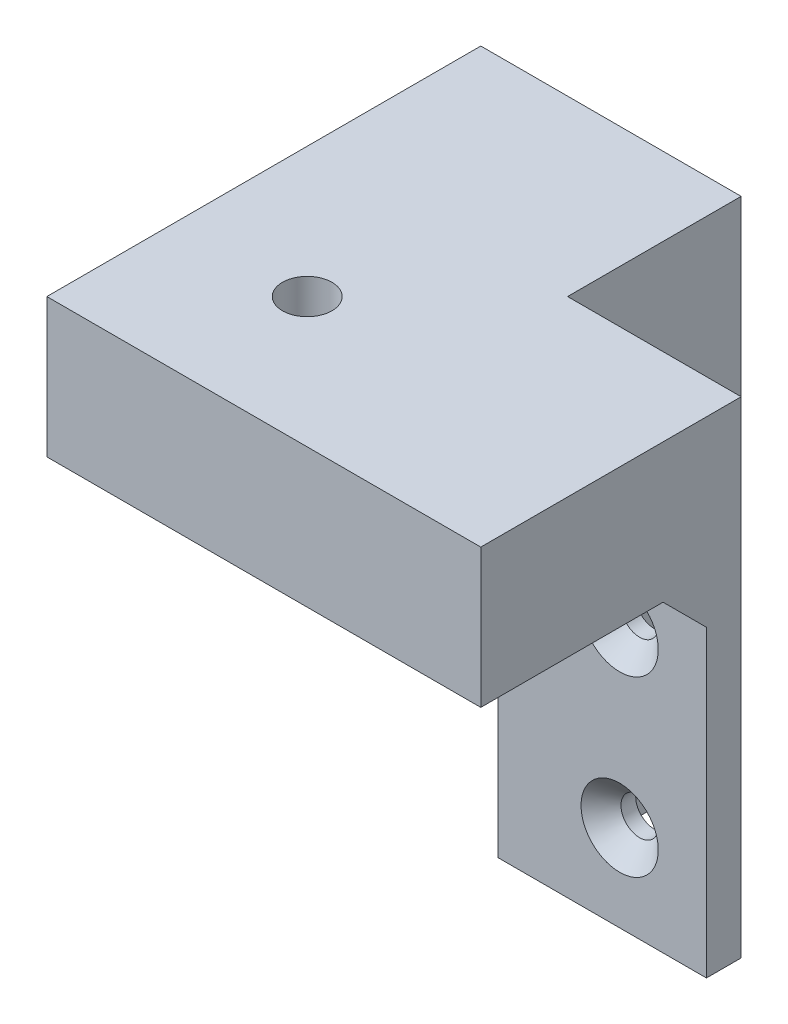
ISO-10303-21;
HEADER;
FILE_DESCRIPTION(('STEP AP214'),'2;1');
FILE_NAME('part.step','',(''),(''),'','','');
FILE_SCHEMA(('AUTOMOTIVE_DESIGN { 1 0 10303 214 1 1 1 1 }'));
ENDSEC;
DATA;
#1=APPLICATION_CONTEXT('core data for automotive mechanical design processes');
#2=APPLICATION_PROTOCOL_DEFINITION('international standard','automotive_design',2000,#1);
#3=PRODUCT_CONTEXT('',#1,'mechanical');
#4=PRODUCT('Part','Part','',(#3));
#5=PRODUCT_RELATED_PRODUCT_CATEGORY('part','',(#4));
#6=PRODUCT_DEFINITION_FORMATION('','',#4);
#7=PRODUCT_DEFINITION_CONTEXT('part definition',#1,'design');
#8=PRODUCT_DEFINITION('design','',#6,#7);
#9=PRODUCT_DEFINITION_SHAPE('','',#8);
#10=(LENGTH_UNIT() NAMED_UNIT(*) SI_UNIT(.MILLI.,.METRE.));
#11=(NAMED_UNIT(*) PLANE_ANGLE_UNIT() SI_UNIT($,.RADIAN.));
#12=(NAMED_UNIT(*) SI_UNIT($,.STERADIAN.) SOLID_ANGLE_UNIT());
#13=UNCERTAINTY_MEASURE_WITH_UNIT(LENGTH_MEASURE(1.E-05),#10,'distance_accuracy_value','');
#14=(GEOMETRIC_REPRESENTATION_CONTEXT(3) GLOBAL_UNCERTAINTY_ASSIGNED_CONTEXT((#13)) GLOBAL_UNIT_ASSIGNED_CONTEXT((#10,
#11,#12)) REPRESENTATION_CONTEXT('',''));
#15=CARTESIAN_POINT('',(0.,0.,0.));
#16=DIRECTION('',(0.,0.,1.));
#17=DIRECTION('',(1.,0.,0.));
#18=AXIS2_PLACEMENT_3D('',#15,#16,#17);
#19=CARTESIAN_POINT('',(-39.9999999999991,-16.,30.));
#20=DIRECTION('',(0.,1.,0.));
#21=DIRECTION('',(0.,0.,1.));
#22=AXIS2_PLACEMENT_3D('',#19,#20,#21);
#23=PLANE('',#22);
#24=CARTESIAN_POINT('',(-24.9999999999991,-16.,15.));
#25=DIRECTION('',(0.,1.,0.));
#26=DIRECTION('',(-1.,0.,0.));
#27=AXIS2_PLACEMENT_3D('',#24,#25,#26);
#28=CIRCLE('',#27,2.85);
#29=CARTESIAN_POINT('',(-27.8499999999991,-16.,15.));
#30=VERTEX_POINT('',#29);
#31=EDGE_CURVE('E226',#30,#30,#28,.T.);
#32=ORIENTED_EDGE('',*,*,#31,.T.);
#33=EDGE_LOOP('',(#32));
#34=FACE_BOUND('',#33,.T.);
#35=DIRECTION('',(1.,0.,0.));
#36=VECTOR('',#35,1.);
#37=CARTESIAN_POINT('',(10.0000000000009,-16.,8.99999999999998));
#38=LINE('',#37,#36);
#39=CARTESIAN_POINT('',(-18.9999999999991,-16.,8.99999999999998));
#40=VERTEX_POINT('',#39);
#41=CARTESIAN_POINT('',(10.0000000000009,-16.,8.99999999999998));
#42=VERTEX_POINT('',#41);
#43=EDGE_CURVE('E188',#40,#42,#38,.T.);
#44=ORIENTED_EDGE('',*,*,#43,.T.);
#45=DIRECTION('',(0.,0.,-1.));
#46=VECTOR('',#45,1.);
#47=CARTESIAN_POINT('',(10.0000000000009,-16.,0.));
#48=LINE('',#47,#46);
#49=CARTESIAN_POINT('',(10.0000000000009,-16.,30.));
#50=VERTEX_POINT('',#49);
#51=EDGE_CURVE('E60',#50,#42,#48,.T.);
#52=ORIENTED_EDGE('',*,*,#51,.F.);
#53=DIRECTION('',(1.,0.,0.));
#54=VECTOR('',#53,1.);
#55=CARTESIAN_POINT('',(-39.9999999999991,-16.,30.));
#56=LINE('',#55,#54);
#57=CARTESIAN_POINT('',(-39.9999999999991,-16.,30.));
#58=VERTEX_POINT('',#57);
#59=EDGE_CURVE('E141',#58,#50,#56,.T.);
#60=ORIENTED_EDGE('',*,*,#59,.F.);
#61=DIRECTION('',(0.,0.,-1.));
#62=VECTOR('',#61,1.);
#63=CARTESIAN_POINT('',(-39.9999999999991,-16.,30.));
#64=LINE('',#63,#62);
#65=CARTESIAN_POINT('',(-39.9999999999991,-16.,-20.));
#66=VERTEX_POINT('',#65);
#67=EDGE_CURVE('E140',#58,#66,#64,.T.);
#68=ORIENTED_EDGE('',*,*,#67,.T.);
#69=DIRECTION('',(-1.,0.,0.));
#70=VECTOR('',#69,1.);
#71=CARTESIAN_POINT('',(-9.99999999999911,-16.,-20.));
#72=LINE('',#71,#70);
#73=CARTESIAN_POINT('',(-18.9999999999991,-16.,-20.));
#74=VERTEX_POINT('',#73);
#75=EDGE_CURVE('E212',#74,#66,#72,.T.);
#76=ORIENTED_EDGE('',*,*,#75,.F.);
#77=DIRECTION('',(0.,0.,1.));
#78=VECTOR('',#77,1.);
#79=CARTESIAN_POINT('',(-18.9999999999991,-16.,4.));
#80=LINE('',#79,#78);
#81=EDGE_CURVE('E186',#74,#40,#80,.T.);
#82=ORIENTED_EDGE('',*,*,#81,.T.);
#83=EDGE_LOOP('',(#44,#52,#60,#68,#76,#82));
#84=FACE_BOUND('',#83,.T.);
#85=ADVANCED_FACE('F35',(#34,#84),#23,.F.);
#86=CARTESIAN_POINT('',(10.0000000000009,0.,30.));
#87=DIRECTION('',(0.,-1.,0.));
#88=DIRECTION('',(1.,0.,0.));
#89=AXIS2_PLACEMENT_3D('',#86,#87,#88);
#90=PLANE('',#89);
#91=CARTESIAN_POINT('',(-24.9999999999991,0.,15.));
#92=DIRECTION('',(0.,1.,0.));
#93=DIRECTION('',(-1.,0.,0.));
#94=AXIS2_PLACEMENT_3D('',#91,#92,#93);
#95=CIRCLE('',#94,2.85);
#96=CARTESIAN_POINT('',(-27.8499999999991,0.,15.));
#97=VERTEX_POINT('',#96);
#98=EDGE_CURVE('E128',#97,#97,#95,.T.);
#99=ORIENTED_EDGE('',*,*,#98,.F.);
#100=EDGE_LOOP('',(#99));
#101=FACE_BOUND('',#100,.T.);
#102=DIRECTION('',(-1.,0.,0.));
#103=VECTOR('',#102,1.);
#104=CARTESIAN_POINT('',(10.0000000000009,0.,0.));
#105=LINE('',#104,#103);
#106=CARTESIAN_POINT('',(10.0000000000009,0.,0.));
#107=VERTEX_POINT('',#106);
#108=CARTESIAN_POINT('',(-9.99999999999911,0.,0.));
#109=VERTEX_POINT('',#108);
#110=EDGE_CURVE('E136',#107,#109,#105,.T.);
#111=ORIENTED_EDGE('',*,*,#110,.T.);
#112=DIRECTION('',(0.,0.,-1.));
#113=VECTOR('',#112,1.);
#114=CARTESIAN_POINT('',(-9.99999999999911,0.,0.));
#115=LINE('',#114,#113);
#116=CARTESIAN_POINT('',(-9.99999999999911,0.,-20.));
#117=VERTEX_POINT('',#116);
#118=EDGE_CURVE('E229',#109,#117,#115,.T.);
#119=ORIENTED_EDGE('',*,*,#118,.T.);
#120=DIRECTION('',(-1.,0.,0.));
#121=VECTOR('',#120,1.);
#122=CARTESIAN_POINT('',(42.4976189936274,0.,-19.9999999999998));
#123=LINE('',#122,#121);
#124=CARTESIAN_POINT('',(-39.9999999999991,0.,-20.));
#125=VERTEX_POINT('',#124);
#126=EDGE_CURVE('E149',#117,#125,#123,.T.);
#127=ORIENTED_EDGE('',*,*,#126,.T.);
#128=DIRECTION('',(0.,0.,-1.));
#129=VECTOR('',#128,1.);
#130=CARTESIAN_POINT('',(-39.9999999999991,0.,30.));
#131=LINE('',#130,#129);
#132=CARTESIAN_POINT('',(-39.9999999999991,0.,30.));
#133=VERTEX_POINT('',#132);
#134=EDGE_CURVE('E156',#133,#125,#131,.T.);
#135=ORIENTED_EDGE('',*,*,#134,.F.);
#136=DIRECTION('',(-1.,0.,0.));
#137=VECTOR('',#136,1.);
#138=CARTESIAN_POINT('',(10.0000000000009,0.,30.));
#139=LINE('',#138,#137);
#140=CARTESIAN_POINT('',(10.0000000000009,0.,30.));
#141=VERTEX_POINT('',#140);
#142=EDGE_CURVE('E139',#141,#133,#139,.T.);
#143=ORIENTED_EDGE('',*,*,#142,.F.);
#144=DIRECTION('',(0.,0.,-1.));
#145=VECTOR('',#144,1.);
#146=CARTESIAN_POINT('',(10.0000000000009,0.,30.));
#147=LINE('',#146,#145);
#148=EDGE_CURVE('E120',#141,#107,#147,.T.);
#149=ORIENTED_EDGE('',*,*,#148,.T.);
#150=EDGE_LOOP('',(#111,#119,#127,#135,#143,#149));
#151=FACE_BOUND('',#150,.T.);
#152=ADVANCED_FACE('F134',(#101,#151),#90,.F.);
#153=CARTESIAN_POINT('',(-39.9999999999991,0.,30.));
#154=DIRECTION('',(1.,0.,0.));
#155=DIRECTION('',(0.,1.,0.));
#156=AXIS2_PLACEMENT_3D('',#153,#154,#155);
#157=PLANE('',#156);
#158=ORIENTED_EDGE('',*,*,#134,.T.);
#159=DIRECTION('',(0.,-1.,0.));
#160=VECTOR('',#159,1.);
#161=CARTESIAN_POINT('',(-39.9999999999991,0.,-20.));
#162=LINE('',#161,#160);
#163=EDGE_CURVE('E240',#125,#66,#162,.T.);
#164=ORIENTED_EDGE('',*,*,#163,.T.);
#165=ORIENTED_EDGE('',*,*,#67,.F.);
#166=DIRECTION('',(0.,-1.,0.));
#167=VECTOR('',#166,1.);
#168=CARTESIAN_POINT('',(-39.9999999999991,0.,30.));
#169=LINE('',#168,#167);
#170=EDGE_CURVE('E147',#133,#58,#169,.T.);
#171=ORIENTED_EDGE('',*,*,#170,.F.);
#172=EDGE_LOOP('',(#158,#164,#165,#171));
#173=FACE_BOUND('',#172,.T.);
#174=ADVANCED_FACE('F272',(#173),#157,.F.);
#175=CARTESIAN_POINT('',(0.,0.,30.));
#176=DIRECTION('',(0.,0.,1.));
#177=DIRECTION('',(1.,0.,0.));
#178=AXIS2_PLACEMENT_3D('',#175,#176,#177);
#179=PLANE('',#178);
#180=DIRECTION('',(0.,-1.,0.));
#181=VECTOR('',#180,1.);
#182=CARTESIAN_POINT('',(10.0000000000009,0.,30.));
#183=LINE('',#182,#181);
#184=EDGE_CURVE('E208',#141,#50,#183,.T.);
#185=ORIENTED_EDGE('',*,*,#184,.F.);
#186=ORIENTED_EDGE('',*,*,#142,.T.);
#187=ORIENTED_EDGE('',*,*,#170,.T.);
#188=ORIENTED_EDGE('',*,*,#59,.T.);
#189=EDGE_LOOP('',(#185,#186,#187,#188));
#190=FACE_BOUND('',#189,.T.);
#191=ADVANCED_FACE('F238',(#190),#179,.T.);
#192=CARTESIAN_POINT('',(0.,0.,0.));
#193=DIRECTION('',(0.,0.,1.));
#194=DIRECTION('',(1.,0.,0.));
#195=AXIS2_PLACEMENT_3D('',#192,#193,#194);
#196=PLANE('',#195);
#197=CARTESIAN_POINT('',(0.,-46.,0.));
#198=DIRECTION('',(0.,0.,-1.));
#199=DIRECTION('',(-1.,0.,0.));
#200=AXIS2_PLACEMENT_3D('',#197,#198,#199);
#201=CIRCLE('',#200,2.15);
#202=CARTESIAN_POINT('',(-2.15,-46.,0.));
#203=VERTEX_POINT('',#202);
#204=EDGE_CURVE('E252',#203,#203,#201,.T.);
#205=ORIENTED_EDGE('',*,*,#204,.F.);
#206=EDGE_LOOP('',(#205));
#207=FACE_BOUND('',#206,.T.);
#208=CARTESIAN_POINT('',(0.,-26.,0.));
#209=DIRECTION('',(0.,0.,-1.));
#210=DIRECTION('',(-1.,0.,0.));
#211=AXIS2_PLACEMENT_3D('',#208,#209,#210);
#212=CIRCLE('',#211,2.15);
#213=CARTESIAN_POINT('',(-2.15,-26.,0.));
#214=VERTEX_POINT('',#213);
#215=EDGE_CURVE('E249',#214,#214,#212,.T.);
#216=ORIENTED_EDGE('',*,*,#215,.F.);
#217=EDGE_LOOP('',(#216));
#218=FACE_BOUND('',#217,.T.);
#219=ORIENTED_EDGE('',*,*,#110,.F.);
#220=DIRECTION('',(0.,1.,0.));
#221=VECTOR('',#220,1.);
#222=CARTESIAN_POINT('',(10.0000000000009,-56.,0.));
#223=LINE('',#222,#221);
#224=CARTESIAN_POINT('',(10.0000000000009,-56.,0.));
#225=VERTEX_POINT('',#224);
#226=EDGE_CURVE('E117',#225,#107,#223,.T.);
#227=ORIENTED_EDGE('',*,*,#226,.F.);
#228=DIRECTION('',(1.,0.,0.));
#229=VECTOR('',#228,1.);
#230=CARTESIAN_POINT('',(10.0000000000009,-56.,0.));
#231=LINE('',#230,#229);
#232=CARTESIAN_POINT('',(-9.99999999999911,-56.,0.));
#233=VERTEX_POINT('',#232);
#234=EDGE_CURVE('E255',#233,#225,#231,.T.);
#235=ORIENTED_EDGE('',*,*,#234,.F.);
#236=DIRECTION('',(0.,1.,0.));
#237=VECTOR('',#236,1.);
#238=CARTESIAN_POINT('',(-9.99999999999911,0.,0.));
#239=LINE('',#238,#237);
#240=EDGE_CURVE('E145',#233,#109,#239,.T.);
#241=ORIENTED_EDGE('',*,*,#240,.T.);
#242=EDGE_LOOP('',(#219,#227,#235,#241));
#243=FACE_BOUND('',#242,.T.);
#244=ADVANCED_FACE('F144',(#207,#218,#243),#196,.F.);
#245=CARTESIAN_POINT('',(-9.99999999999911,-120.,2.13370987545147E-13));
#246=DIRECTION('',(1.,0.,0.));
#247=DIRECTION('',(0.,-1.,0.));
#248=AXIS2_PLACEMENT_3D('',#245,#246,#247);
#249=PLANE('',#248);
#250=DIRECTION('',(0.,1.,0.));
#251=VECTOR('',#250,1.);
#252=CARTESIAN_POINT('',(-9.99999999999912,-56.,-20.));
#253=LINE('',#252,#251);
#254=CARTESIAN_POINT('',(-9.99999999999912,-56.,-20.));
#255=VERTEX_POINT('',#254);
#256=EDGE_CURVE('E219',#255,#117,#253,.T.);
#257=ORIENTED_EDGE('',*,*,#256,.T.);
#258=ORIENTED_EDGE('',*,*,#118,.F.);
#259=ORIENTED_EDGE('',*,*,#240,.F.);
#260=DIRECTION('',(0.,0.,1.));
#261=VECTOR('',#260,1.);
#262=CARTESIAN_POINT('',(-9.99999999999911,-56.,0.));
#263=LINE('',#262,#261);
#264=EDGE_CURVE('E222',#255,#233,#263,.T.);
#265=ORIENTED_EDGE('',*,*,#264,.F.);
#266=EDGE_LOOP('',(#257,#258,#259,#265));
#267=FACE_BOUND('',#266,.T.);
#268=CARTESIAN_POINT('',(-9.99999999999911,-46.,-10.));
#269=DIRECTION('',(1.,0.,0.));
#270=DIRECTION('',(0.,0.,-1.));
#271=AXIS2_PLACEMENT_3D('',#268,#269,#270);
#272=CIRCLE('',#271,2.15);
#273=CARTESIAN_POINT('',(-9.99999999999911,-46.,-12.15));
#274=VERTEX_POINT('',#273);
#275=EDGE_CURVE('E246',#274,#274,#272,.T.);
#276=ORIENTED_EDGE('',*,*,#275,.F.);
#277=EDGE_LOOP('',(#276));
#278=FACE_BOUND('',#277,.T.);
#279=CARTESIAN_POINT('',(-9.99999999999911,-26.,-10.));
#280=DIRECTION('',(1.,0.,0.));
#281=DIRECTION('',(0.,0.,-1.));
#282=AXIS2_PLACEMENT_3D('',#279,#280,#281);
#283=CIRCLE('',#282,2.15);
#284=CARTESIAN_POINT('',(-9.99999999999911,-26.,-12.15));
#285=VERTEX_POINT('',#284);
#286=EDGE_CURVE('E207',#285,#285,#283,.T.);
#287=ORIENTED_EDGE('',*,*,#286,.F.);
#288=EDGE_LOOP('',(#287));
#289=FACE_BOUND('',#288,.T.);
#290=ADVANCED_FACE('F268',(#267,#278,#289),#249,.T.);
#291=CARTESIAN_POINT('',(-24.9999999999991,-16.,15.));
#292=DIRECTION('',(0.,1.,0.));
#293=DIRECTION('',(-1.,0.,0.));
#294=AXIS2_PLACEMENT_3D('',#291,#292,#293);
#295=CYLINDRICAL_SURFACE('',#294,2.85);
#296=ORIENTED_EDGE('',*,*,#31,.F.);
#297=EDGE_LOOP('',(#296));
#298=FACE_BOUND('',#297,.T.);
#299=ORIENTED_EDGE('',*,*,#98,.T.);
#300=EDGE_LOOP('',(#299));
#301=FACE_BOUND('',#300,.T.);
#302=ADVANCED_FACE('F294',(#298,#301),#295,.F.);
#303=CARTESIAN_POINT('',(10.0000000000009,-56.,4.));
#304=DIRECTION('',(-1.,0.,0.));
#305=DIRECTION('',(0.,0.,1.));
#306=AXIS2_PLACEMENT_3D('',#303,#304,#305);
#307=PLANE('',#306);
#308=ORIENTED_EDGE('',*,*,#226,.T.);
#309=ORIENTED_EDGE('',*,*,#148,.F.);
#310=ORIENTED_EDGE('',*,*,#184,.T.);
#311=ORIENTED_EDGE('',*,*,#51,.T.);
#312=DIRECTION('',(0.,0.707106781186551,0.707106781186544));
#313=VECTOR('',#312,1.);
#314=CARTESIAN_POINT('',(10.0000000000009,-38.5000000000002,-13.5));
#315=LINE('',#314,#313);
#316=CARTESIAN_POINT('',(10.0000000000009,-21.,4.));
#317=VERTEX_POINT('',#316);
#318=EDGE_CURVE('E45',#42,#317,#315,.F.);
#319=ORIENTED_EDGE('',*,*,#318,.T.);
#320=DIRECTION('',(0.,1.,0.));
#321=VECTOR('',#320,1.);
#322=CARTESIAN_POINT('',(10.0000000000009,-56.,4.));
#323=LINE('',#322,#321);
#324=CARTESIAN_POINT('',(10.0000000000009,-56.,4.));
#325=VERTEX_POINT('',#324);
#326=EDGE_CURVE('E129',#325,#317,#323,.T.);
#327=ORIENTED_EDGE('',*,*,#326,.F.);
#328=DIRECTION('',(0.,0.,1.));
#329=VECTOR('',#328,1.);
#330=CARTESIAN_POINT('',(10.0000000000009,-56.,4.));
#331=LINE('',#330,#329);
#332=EDGE_CURVE('E123',#225,#325,#331,.T.);
#333=ORIENTED_EDGE('',*,*,#332,.F.);
#334=EDGE_LOOP('',(#308,#309,#310,#311,#319,#327,#333));
#335=FACE_BOUND('',#334,.T.);
#336=ADVANCED_FACE('F119',(#335),#307,.F.);
#337=CARTESIAN_POINT('',(-13.9999999999991,-56.,4.));
#338=DIRECTION('',(0.,0.,-1.));
#339=DIRECTION('',(-1.,0.,0.));
#340=AXIS2_PLACEMENT_3D('',#337,#338,#339);
#341=PLANE('',#340);
#342=CARTESIAN_POINT('',(0.,-46.,4.));
#343=DIRECTION('',(0.,0.,-1.));
#344=DIRECTION('',(-1.,0.,0.));
#345=AXIS2_PLACEMENT_3D('',#342,#343,#344);
#346=CIRCLE('',#345,4.45000000000001);
#347=CARTESIAN_POINT('',(-4.45000000000001,-46.,4.));
#348=VERTEX_POINT('',#347);
#349=EDGE_CURVE('E174',#348,#348,#346,.T.);
#350=ORIENTED_EDGE('',*,*,#349,.T.);
#351=EDGE_LOOP('',(#350));
#352=FACE_BOUND('',#351,.T.);
#353=CARTESIAN_POINT('',(0.,-26.,4.));
#354=DIRECTION('',(0.,0.,-1.));
#355=DIRECTION('',(-1.,0.,0.));
#356=AXIS2_PLACEMENT_3D('',#353,#354,#355);
#357=CIRCLE('',#356,4.45000000000001);
#358=CARTESIAN_POINT('',(-4.45000000000001,-26.,4.));
#359=VERTEX_POINT('',#358);
#360=EDGE_CURVE('E171',#359,#359,#357,.T.);
#361=ORIENTED_EDGE('',*,*,#360,.T.);
#362=EDGE_LOOP('',(#361));
#363=FACE_BOUND('',#362,.T.);
#364=ORIENTED_EDGE('',*,*,#326,.T.);
#365=DIRECTION('',(-1.,0.,0.));
#366=VECTOR('',#365,1.);
#367=CARTESIAN_POINT('',(-13.9999999999991,-21.,4.));
#368=LINE('',#367,#366);
#369=CARTESIAN_POINT('',(-13.9999999999991,-21.,4.));
#370=VERTEX_POINT('',#369);
#371=EDGE_CURVE('E183',#317,#370,#368,.T.);
#372=ORIENTED_EDGE('',*,*,#371,.T.);
#373=DIRECTION('',(0.,1.,0.));
#374=VECTOR('',#373,1.);
#375=CARTESIAN_POINT('',(-13.9999999999991,-56.,4.));
#376=LINE('',#375,#374);
#377=CARTESIAN_POINT('',(-13.9999999999991,-56.,4.));
#378=VERTEX_POINT('',#377);
#379=EDGE_CURVE('E201',#378,#370,#376,.T.);
#380=ORIENTED_EDGE('',*,*,#379,.F.);
#381=DIRECTION('',(-1.,0.,0.));
#382=VECTOR('',#381,1.);
#383=CARTESIAN_POINT('',(-13.9999999999991,-56.,4.));
#384=LINE('',#383,#382);
#385=EDGE_CURVE('E200',#325,#378,#384,.T.);
#386=ORIENTED_EDGE('',*,*,#385,.F.);
#387=EDGE_LOOP('',(#364,#372,#380,#386));
#388=FACE_BOUND('',#387,.T.);
#389=ADVANCED_FACE('F198',(#352,#363,#388),#341,.F.);
#390=CARTESIAN_POINT('',(-13.9999999999991,-56.,-20.));
#391=DIRECTION('',(1.,0.,0.));
#392=DIRECTION('',(0.,0.,-1.));
#393=AXIS2_PLACEMENT_3D('',#390,#391,#392);
#394=PLANE('',#393);
#395=CARTESIAN_POINT('',(-13.9999999999991,-26.,-10.));
#396=DIRECTION('',(1.,0.,0.));
#397=DIRECTION('',(0.,0.,-1.));
#398=AXIS2_PLACEMENT_3D('',#395,#396,#397);
#399=CIRCLE('',#398,4.45);
#400=CARTESIAN_POINT('',(-13.9999999999991,-26.,-14.45));
#401=VERTEX_POINT('',#400);
#402=EDGE_CURVE('E162',#401,#401,#399,.T.);
#403=ORIENTED_EDGE('',*,*,#402,.T.);
#404=EDGE_LOOP('',(#403));
#405=FACE_BOUND('',#404,.T.);
#406=CARTESIAN_POINT('',(-13.9999999999991,-46.,-10.));
#407=DIRECTION('',(1.,0.,0.));
#408=DIRECTION('',(0.,0.,-1.));
#409=AXIS2_PLACEMENT_3D('',#406,#407,#408);
#410=CIRCLE('',#409,4.45000000000004);
#411=CARTESIAN_POINT('',(-13.9999999999991,-46.,-5.54999999999996));
#412=VERTEX_POINT('',#411);
#413=EDGE_CURVE('E159',#412,#412,#410,.T.);
#414=ORIENTED_EDGE('',*,*,#413,.T.);
#415=EDGE_LOOP('',(#414));
#416=FACE_BOUND('',#415,.T.);
#417=ORIENTED_EDGE('',*,*,#379,.T.);
#418=DIRECTION('',(0.,0.,-1.));
#419=VECTOR('',#418,1.);
#420=CARTESIAN_POINT('',(-13.9999999999991,-21.,-20.));
#421=LINE('',#420,#419);
#422=CARTESIAN_POINT('',(-13.9999999999991,-21.,-20.));
#423=VERTEX_POINT('',#422);
#424=EDGE_CURVE('E52',#370,#423,#421,.T.);
#425=ORIENTED_EDGE('',*,*,#424,.T.);
#426=DIRECTION('',(0.,1.,0.));
#427=VECTOR('',#426,1.);
#428=CARTESIAN_POINT('',(-13.9999999999991,-56.,-20.));
#429=LINE('',#428,#427);
#430=CARTESIAN_POINT('',(-13.9999999999991,-56.,-20.));
#431=VERTEX_POINT('',#430);
#432=EDGE_CURVE('E215',#431,#423,#429,.T.);
#433=ORIENTED_EDGE('',*,*,#432,.F.);
#434=DIRECTION('',(0.,0.,-1.));
#435=VECTOR('',#434,1.);
#436=CARTESIAN_POINT('',(-13.9999999999991,-56.,-20.));
#437=LINE('',#436,#435);
#438=EDGE_CURVE('E261',#378,#431,#437,.T.);
#439=ORIENTED_EDGE('',*,*,#438,.F.);
#440=EDGE_LOOP('',(#417,#425,#433,#439));
#441=FACE_BOUND('',#440,.T.);
#442=ADVANCED_FACE('F302',(#405,#416,#441),#394,.F.);
#443=CARTESIAN_POINT('',(-9.99999999999912,-56.,-20.));
#444=DIRECTION('',(0.,0.,1.));
#445=DIRECTION('',(1.,0.,0.));
#446=AXIS2_PLACEMENT_3D('',#443,#444,#445);
#447=PLANE('',#446);
#448=DIRECTION('',(0.707106781186544,-0.707106781186551,0.));
#449=VECTOR('',#448,1.);
#450=CARTESIAN_POINT('',(5.50000000000085,-40.5000000000002,-20.));
#451=LINE('',#450,#449);
#452=EDGE_CURVE('E11',#423,#74,#451,.F.);
#453=ORIENTED_EDGE('',*,*,#452,.T.);
#454=ORIENTED_EDGE('',*,*,#75,.T.);
#455=ORIENTED_EDGE('',*,*,#163,.F.);
#456=ORIENTED_EDGE('',*,*,#126,.F.);
#457=ORIENTED_EDGE('',*,*,#256,.F.);
#458=DIRECTION('',(1.,0.,0.));
#459=VECTOR('',#458,1.);
#460=CARTESIAN_POINT('',(-9.99999999999912,-56.,-20.));
#461=LINE('',#460,#459);
#462=EDGE_CURVE('E217',#431,#255,#461,.T.);
#463=ORIENTED_EDGE('',*,*,#462,.F.);
#464=ORIENTED_EDGE('',*,*,#432,.T.);
#465=EDGE_LOOP('',(#453,#454,#455,#456,#457,#463,#464));
#466=FACE_BOUND('',#465,.T.);
#467=ADVANCED_FACE('F211',(#466),#447,.F.);
#468=CARTESIAN_POINT('',(0.,-56.,0.));
#469=DIRECTION('',(0.,-1.,0.));
#470=DIRECTION('',(0.,0.,-1.));
#471=AXIS2_PLACEMENT_3D('',#468,#469,#470);
#472=PLANE('',#471);
#473=ORIENTED_EDGE('',*,*,#234,.T.);
#474=ORIENTED_EDGE('',*,*,#332,.T.);
#475=ORIENTED_EDGE('',*,*,#385,.T.);
#476=ORIENTED_EDGE('',*,*,#438,.T.);
#477=ORIENTED_EDGE('',*,*,#462,.T.);
#478=ORIENTED_EDGE('',*,*,#264,.T.);
#479=EDGE_LOOP('',(#473,#474,#475,#476,#477,#478));
#480=FACE_BOUND('',#479,.T.);
#481=ADVANCED_FACE('F266',(#480),#472,.T.);
#482=CARTESIAN_POINT('',(0.,-26.,30.));
#483=DIRECTION('',(0.,0.,-1.));
#484=DIRECTION('',(-1.,0.,0.));
#485=AXIS2_PLACEMENT_3D('',#482,#483,#484);
#486=CYLINDRICAL_SURFACE('',#485,2.15);
#487=CARTESIAN_POINT('',(0.,-26.,1.69999999999998));
#488=DIRECTION('',(0.,0.,-1.));
#489=DIRECTION('',(-1.,0.,0.));
#490=AXIS2_PLACEMENT_3D('',#487,#488,#489);
#491=CIRCLE('',#490,2.15);
#492=CARTESIAN_POINT('',(-2.15,-26.,1.69999999999998));
#493=VERTEX_POINT('',#492);
#494=EDGE_CURVE('E180',#493,#493,#491,.F.);
#495=ORIENTED_EDGE('',*,*,#494,.T.);
#496=EDGE_LOOP('',(#495));
#497=FACE_BOUND('',#496,.T.);
#498=ORIENTED_EDGE('',*,*,#215,.T.);
#499=EDGE_LOOP('',(#498));
#500=FACE_BOUND('',#499,.T.);
#501=ADVANCED_FACE('F311',(#497,#500),#486,.F.);
#502=CARTESIAN_POINT('',(0.,-46.,30.));
#503=DIRECTION('',(0.,0.,-1.));
#504=DIRECTION('',(-1.,0.,0.));
#505=AXIS2_PLACEMENT_3D('',#502,#503,#504);
#506=CYLINDRICAL_SURFACE('',#505,2.15);
#507=CARTESIAN_POINT('',(0.,-46.,1.69999999999998));
#508=DIRECTION('',(0.,0.,-1.));
#509=DIRECTION('',(-1.,0.,0.));
#510=AXIS2_PLACEMENT_3D('',#507,#508,#509);
#511=CIRCLE('',#510,2.15);
#512=CARTESIAN_POINT('',(-2.15,-46.,1.69999999999998));
#513=VERTEX_POINT('',#512);
#514=EDGE_CURVE('E177',#513,#513,#511,.F.);
#515=ORIENTED_EDGE('',*,*,#514,.T.);
#516=EDGE_LOOP('',(#515));
#517=FACE_BOUND('',#516,.T.);
#518=ORIENTED_EDGE('',*,*,#204,.T.);
#519=EDGE_LOOP('',(#518));
#520=FACE_BOUND('',#519,.T.);
#521=ADVANCED_FACE('F314',(#517,#520),#506,.F.);
#522=CARTESIAN_POINT('',(-39.9999999999991,-26.,-10.));
#523=DIRECTION('',(1.,0.,0.));
#524=DIRECTION('',(0.,0.,-1.));
#525=AXIS2_PLACEMENT_3D('',#522,#523,#524);
#526=CYLINDRICAL_SURFACE('',#525,2.15);
#527=CARTESIAN_POINT('',(-11.6999999999991,-26.,-10.));
#528=DIRECTION('',(1.,0.,0.));
#529=DIRECTION('',(0.,0.,-1.));
#530=AXIS2_PLACEMENT_3D('',#527,#528,#529);
#531=CIRCLE('',#530,2.15);
#532=CARTESIAN_POINT('',(-11.6999999999991,-26.,-12.15));
#533=VERTEX_POINT('',#532);
#534=EDGE_CURVE('E165',#533,#533,#531,.F.);
#535=ORIENTED_EDGE('',*,*,#534,.T.);
#536=EDGE_LOOP('',(#535));
#537=FACE_BOUND('',#536,.T.);
#538=ORIENTED_EDGE('',*,*,#286,.T.);
#539=EDGE_LOOP('',(#538));
#540=FACE_BOUND('',#539,.T.);
#541=ADVANCED_FACE('F318',(#537,#540),#526,.F.);
#542=CARTESIAN_POINT('',(-39.9999999999991,-46.,-10.));
#543=DIRECTION('',(1.,0.,0.));
#544=DIRECTION('',(0.,0.,-1.));
#545=AXIS2_PLACEMENT_3D('',#542,#543,#544);
#546=CYLINDRICAL_SURFACE('',#545,2.15);
#547=CARTESIAN_POINT('',(-11.6999999999991,-46.,-10.));
#548=DIRECTION('',(1.,0.,0.));
#549=DIRECTION('',(0.,0.,-1.));
#550=AXIS2_PLACEMENT_3D('',#547,#548,#549);
#551=CIRCLE('',#550,2.15);
#552=CARTESIAN_POINT('',(-11.6999999999991,-46.,-7.85));
#553=VERTEX_POINT('',#552);
#554=EDGE_CURVE('E168',#553,#553,#551,.F.);
#555=ORIENTED_EDGE('',*,*,#554,.T.);
#556=EDGE_LOOP('',(#555));
#557=FACE_BOUND('',#556,.T.);
#558=ORIENTED_EDGE('',*,*,#275,.T.);
#559=EDGE_LOOP('',(#558));
#560=FACE_BOUND('',#559,.T.);
#561=ADVANCED_FACE('F322',(#557,#560),#546,.F.);
#562=CARTESIAN_POINT('',(-13.9999999999991,-26.,-10.));
#563=DIRECTION('',(-1.,0.,0.));
#564=DIRECTION('',(0.,0.,1.));
#565=AXIS2_PLACEMENT_3D('',#562,#563,#564);
#566=CONICAL_SURFACE('',#565,4.45,0.785398163397447);
#567=ORIENTED_EDGE('',*,*,#534,.F.);
#568=EDGE_LOOP('',(#567));
#569=FACE_BOUND('',#568,.T.);
#570=ORIENTED_EDGE('',*,*,#402,.F.);
#571=EDGE_LOOP('',(#570));
#572=FACE_BOUND('',#571,.T.);
#573=ADVANCED_FACE('F325',(#569,#572),#566,.F.);
#574=CARTESIAN_POINT('',(-13.9999999999991,-46.,-10.));
#575=DIRECTION('',(-1.,0.,0.));
#576=DIRECTION('',(0.,0.,1.));
#577=AXIS2_PLACEMENT_3D('',#574,#575,#576);
#578=CONICAL_SURFACE('',#577,4.45000000000004,0.785398163397447);
#579=CARTESIAN_POINT('',(-11.6999999999991,-46.,-7.85));
#580=CARTESIAN_POINT('',(-11.7239583333324,-46.,-7.82604166666666));
#581=CARTESIAN_POINT('',(-11.7479166666657,-46.,-7.80208333333333));
#582=CARTESIAN_POINT('',(-11.7958333333324,-46.,-7.75416666666666));
#583=CARTESIAN_POINT('',(-11.8197916666657,-46.,-7.73020833333333));
#584=CARTESIAN_POINT('',(-11.8677083333324,-46.,-7.68229166666666));
#585=CARTESIAN_POINT('',(-11.8916666666657,-46.,-7.65833333333333));
#586=CARTESIAN_POINT('',(-11.9395833333324,-46.,-7.61041666666666));
#587=CARTESIAN_POINT('',(-11.9635416666658,-46.,-7.58645833333333));
#588=CARTESIAN_POINT('',(-12.0114583333324,-46.,-7.53854166666666));
#589=CARTESIAN_POINT('',(-12.0354166666658,-46.,-7.51458333333333));
#590=CARTESIAN_POINT('',(-12.0833333333324,-46.,-7.46666666666666));
#591=CARTESIAN_POINT('',(-12.1072916666658,-46.,-7.44270833333332));
#592=CARTESIAN_POINT('',(-12.1552083333324,-46.,-7.39479166666666));
#593=CARTESIAN_POINT('',(-12.1791666666658,-46.,-7.37083333333332));
#594=CARTESIAN_POINT('',(-12.2270833333324,-46.,-7.32291666666666));
#595=CARTESIAN_POINT('',(-12.2510416666658,-46.,-7.29895833333332));
#596=CARTESIAN_POINT('',(-12.2989583333324,-46.,-7.25104166666666));
#597=CARTESIAN_POINT('',(-12.3229166666658,-46.,-7.22708333333332));
#598=CARTESIAN_POINT('',(-12.3708333333324,-46.,-7.17916666666665));
#599=CARTESIAN_POINT('',(-12.3947916666658,-46.,-7.15520833333332));
#600=CARTESIAN_POINT('',(-12.4427083333324,-46.,-7.10729166666665));
#601=CARTESIAN_POINT('',(-12.4666666666658,-46.,-7.08333333333332));
#602=CARTESIAN_POINT('',(-12.5145833333324,-46.,-7.03541666666665));
#603=CARTESIAN_POINT('',(-12.5385416666658,-46.,-7.01145833333332));
#604=CARTESIAN_POINT('',(-12.5864583333324,-46.,-6.96354166666665));
#605=CARTESIAN_POINT('',(-12.6104166666658,-46.,-6.93958333333332));
#606=CARTESIAN_POINT('',(-12.6583333333324,-46.,-6.89166666666665));
#607=CARTESIAN_POINT('',(-12.6822916666658,-46.,-6.86770833333332));
#608=CARTESIAN_POINT('',(-12.7302083333324,-46.,-6.81979166666665));
#609=CARTESIAN_POINT('',(-12.7541666666658,-46.,-6.79583333333331));
#610=CARTESIAN_POINT('',(-12.8020833333324,-46.,-6.74791666666665));
#611=CARTESIAN_POINT('',(-12.8260416666658,-46.,-6.72395833333331));
#612=CARTESIAN_POINT('',(-12.8739583333324,-46.,-6.67604166666665));
#613=CARTESIAN_POINT('',(-12.8979166666658,-46.,-6.65208333333331));
#614=CARTESIAN_POINT('',(-12.9458333333324,-46.,-6.60416666666664));
#615=CARTESIAN_POINT('',(-12.9697916666658,-46.,-6.58020833333331));
#616=CARTESIAN_POINT('',(-13.0177083333324,-46.,-6.53229166666664));
#617=CARTESIAN_POINT('',(-13.0416666666658,-46.,-6.50833333333331));
#618=CARTESIAN_POINT('',(-13.0895833333324,-46.,-6.46041666666664));
#619=CARTESIAN_POINT('',(-13.1135416666658,-46.,-6.43645833333331));
#620=CARTESIAN_POINT('',(-13.1614583333324,-46.,-6.38854166666664));
#621=CARTESIAN_POINT('',(-13.1854166666658,-46.,-6.36458333333331));
#622=CARTESIAN_POINT('',(-13.2333333333324,-46.,-6.31666666666664));
#623=CARTESIAN_POINT('',(-13.2572916666658,-46.,-6.29270833333331));
#624=CARTESIAN_POINT('',(-13.3052083333324,-46.,-6.24479166666664));
#625=CARTESIAN_POINT('',(-13.3291666666658,-46.,-6.2208333333333));
#626=CARTESIAN_POINT('',(-13.3770833333324,-46.,-6.17291666666664));
#627=CARTESIAN_POINT('',(-13.4010416666658,-46.,-6.1489583333333));
#628=CARTESIAN_POINT('',(-13.4489583333324,-46.,-6.10104166666664));
#629=CARTESIAN_POINT('',(-13.4729166666658,-46.,-6.0770833333333));
#630=CARTESIAN_POINT('',(-13.5208333333324,-46.,-6.02916666666664));
#631=CARTESIAN_POINT('',(-13.5447916666658,-46.,-6.0052083333333));
#632=CARTESIAN_POINT('',(-13.5927083333324,-46.,-5.95729166666663));
#633=CARTESIAN_POINT('',(-13.6166666666658,-46.,-5.9333333333333));
#634=CARTESIAN_POINT('',(-13.6645833333324,-46.,-5.88541666666663));
#635=CARTESIAN_POINT('',(-13.6885416666658,-46.,-5.8614583333333));
#636=CARTESIAN_POINT('',(-13.7364583333325,-46.,-5.81354166666663));
#637=CARTESIAN_POINT('',(-13.7604166666658,-46.,-5.7895833333333));
#638=CARTESIAN_POINT('',(-13.8083333333325,-46.,-5.74166666666663));
#639=CARTESIAN_POINT('',(-13.8322916666658,-46.,-5.7177083333333));
#640=CARTESIAN_POINT('',(-13.8802083333325,-46.,-5.66979166666663));
#641=CARTESIAN_POINT('',(-13.9041666666658,-46.,-5.6458333333333));
#642=CARTESIAN_POINT('',(-13.9520833333325,-46.,-5.59791666666663));
#643=CARTESIAN_POINT('',(-13.9760416666658,-46.,-5.5739583333333));
#644=CARTESIAN_POINT('',(-13.9999999999991,-46.,-5.54999999999996));
#645=B_SPLINE_CURVE_WITH_KNOTS('',3,(#579,#580,#581,#582,#583,#584,#585,#586,#587,#588,#589,
#590,#591,#592,#593,#594,#595,#596,#597,#598,#599,#600,#601,#602,#603,#604,#605,#606,#607,#608,
#609,#610,#611,#612,#613,#614,#615,#616,#617,#618,#619,#620,#621,#622,#623,#624,#625,#626,#627,
#628,#629,#630,#631,#632,#633,#634,#635,#636,#637,#638,#639,#640,#641,#642,#643,#644),
.UNSPECIFIED.,.F.,.F.,(4,2,2,2,2,2,2,2,2,2,2,2,2,2,2,2,2,2,2,2,2,2,2,2,2,2,2,2,2,2,2,2,4),(0.,
0.101646599795567,0.203293199591135,0.304939799386702,0.40658639918227,0.508232998977838,
0.609879598773406,0.711526198568975,0.813172798364542,0.914819398160109,1.01646599795568,
1.11811259775125,1.21975919754681,1.32140579734238,1.42305239713795,1.52469899693352,
1.62634559672908,1.72799219652465,1.82963879632022,1.93128539611579,2.03293199591136,
2.13457859570692,2.23622519550249,2.33787179529806,2.43951839509363,2.5411649948892,
2.64281159468476,2.74445819448033,2.8461047942759,2.94775139407147,3.04939799386703,
3.1510445936626,3.25269119345817),.UNSPECIFIED.);
#646=EDGE_CURVE('BSEAM330',#553,#412,#645,.T.);
#647=ORIENTED_EDGE('',*,*,#554,.F.);
#648=ORIENTED_EDGE('',*,*,#413,.F.);
#649=ORIENTED_EDGE('',*,*,#646,.T.);
#650=ORIENTED_EDGE('',*,*,#646,.F.);
#651=EDGE_LOOP('',(#647,#649,#648,#650));
#652=FACE_BOUND('',#651,.T.);
#653=ADVANCED_FACE('F330',(#652),#578,.F.);
#654=CARTESIAN_POINT('',(0.,-46.,4.));
#655=DIRECTION('',(0.,0.,1.));
#656=DIRECTION('',(1.,0.,0.));
#657=AXIS2_PLACEMENT_3D('',#654,#655,#656);
#658=CONICAL_SURFACE('',#657,4.45000000000001,0.785398163397447);
#659=ORIENTED_EDGE('',*,*,#514,.F.);
#660=EDGE_LOOP('',(#659));
#661=FACE_BOUND('',#660,.T.);
#662=ORIENTED_EDGE('',*,*,#349,.F.);
#663=EDGE_LOOP('',(#662));
#664=FACE_BOUND('',#663,.T.);
#665=ADVANCED_FACE('F342',(#661,#664),#658,.F.);
#666=CARTESIAN_POINT('',(0.,-26.,4.));
#667=DIRECTION('',(0.,0.,1.));
#668=DIRECTION('',(1.,0.,0.));
#669=AXIS2_PLACEMENT_3D('',#666,#667,#668);
#670=CONICAL_SURFACE('',#669,4.45000000000001,0.785398163397447);
#671=ORIENTED_EDGE('',*,*,#494,.F.);
#672=EDGE_LOOP('',(#671));
#673=FACE_BOUND('',#672,.T.);
#674=ORIENTED_EDGE('',*,*,#360,.F.);
#675=EDGE_LOOP('',(#674));
#676=FACE_BOUND('',#675,.T.);
#677=ADVANCED_FACE('F349',(#673,#676),#670,.F.);
#678=CARTESIAN_POINT('',(-13.9999999999991,-21.,-20.));
#679=DIRECTION('',(-0.707106781186551,-0.707106781186544,0.));
#680=DIRECTION('',(0.,0.,1.));
#681=AXIS2_PLACEMENT_3D('',#678,#679,#680);
#682=PLANE('',#681);
#683=ORIENTED_EDGE('',*,*,#452,.F.);
#684=ORIENTED_EDGE('',*,*,#424,.F.);
#685=DIRECTION('',(-0.577350269189624,0.57735026918963,0.577350269189624));
#686=VECTOR('',#685,1.);
#687=CARTESIAN_POINT('',(-5.99999999999917,-29.0000000000001,-3.99999999999994));
#688=LINE('',#687,#686);
#689=EDGE_CURVE('E40',#40,#370,#688,.F.);
#690=ORIENTED_EDGE('',*,*,#689,.F.);
#691=ORIENTED_EDGE('',*,*,#81,.F.);
#692=EDGE_LOOP('',(#683,#684,#690,#691));
#693=FACE_BOUND('',#692,.T.);
#694=ADVANCED_FACE('F38',(#693),#682,.T.);
#695=CARTESIAN_POINT('',(-13.9999999999991,-21.,4.));
#696=DIRECTION('',(0.,-0.707106781186544,0.707106781186551));
#697=DIRECTION('',(1.,0.,0.));
#698=AXIS2_PLACEMENT_3D('',#695,#696,#697);
#699=PLANE('',#698);
#700=ORIENTED_EDGE('',*,*,#318,.F.);
#701=ORIENTED_EDGE('',*,*,#43,.F.);
#702=ORIENTED_EDGE('',*,*,#689,.T.);
#703=ORIENTED_EDGE('',*,*,#371,.F.);
#704=EDGE_LOOP('',(#700,#701,#702,#703));
#705=FACE_BOUND('',#704,.T.);
#706=ADVANCED_FACE('F203',(#705),#699,.T.);
#707=CLOSED_SHELL('',(#85,#152,#174,#191,#244,#290,#302,#336,#389,#442,#467,#481,#501,#521,#541,
#561,#573,#653,#665,#677,#694,#706));
#708=MANIFOLD_SOLID_BREP('B2',#707);
#709=ADVANCED_BREP_SHAPE_REPRESENTATION('',(#18,#708),#14);
#710=SHAPE_DEFINITION_REPRESENTATION(#9,#709);
ENDSEC;
END-ISO-10303-21;
